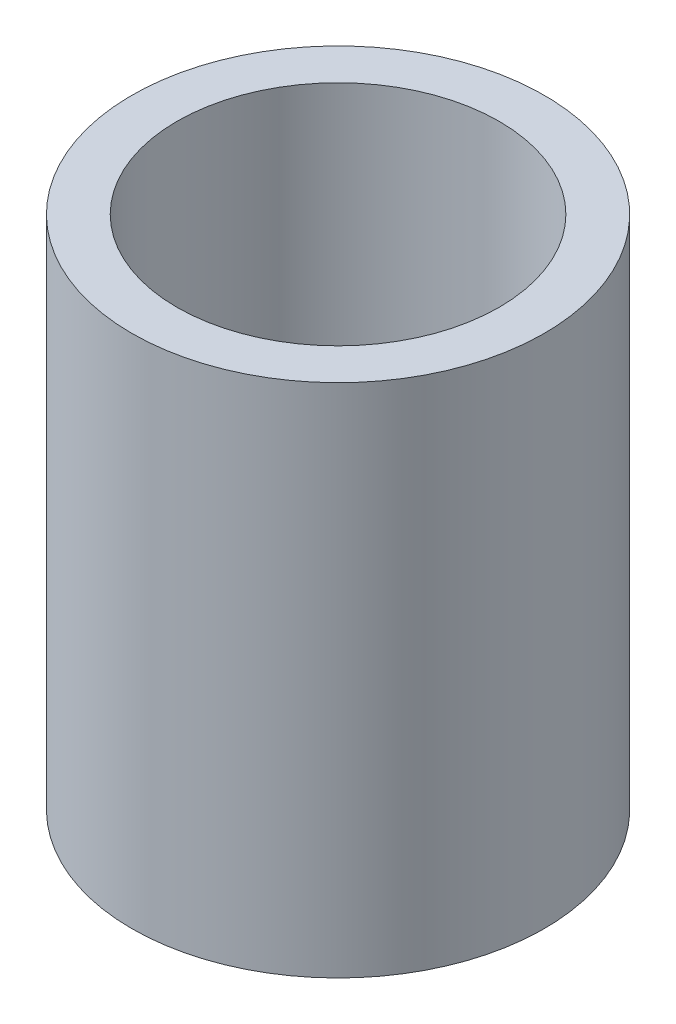
ISO-10303-21;
HEADER;
FILE_DESCRIPTION(('STEP AP214'),'2;1');
FILE_NAME('part.step','',(''),(''),'','','');
FILE_SCHEMA(('AUTOMOTIVE_DESIGN { 1 0 10303 214 1 1 1 1 }'));
ENDSEC;
DATA;
#1=APPLICATION_CONTEXT('core data for automotive mechanical design processes');
#2=APPLICATION_PROTOCOL_DEFINITION('international standard','automotive_design',2000,#1);
#3=PRODUCT_CONTEXT('',#1,'mechanical');
#4=PRODUCT('Part','Part','',(#3));
#5=PRODUCT_RELATED_PRODUCT_CATEGORY('part','',(#4));
#6=PRODUCT_DEFINITION_FORMATION('','',#4);
#7=PRODUCT_DEFINITION_CONTEXT('part definition',#1,'design');
#8=PRODUCT_DEFINITION('design','',#6,#7);
#9=PRODUCT_DEFINITION_SHAPE('','',#8);
#10=(LENGTH_UNIT() NAMED_UNIT(*) SI_UNIT(.MILLI.,.METRE.));
#11=(NAMED_UNIT(*) PLANE_ANGLE_UNIT() SI_UNIT($,.RADIAN.));
#12=(NAMED_UNIT(*) SI_UNIT($,.STERADIAN.) SOLID_ANGLE_UNIT());
#13=UNCERTAINTY_MEASURE_WITH_UNIT(LENGTH_MEASURE(1.E-05),#10,'distance_accuracy_value','');
#14=(GEOMETRIC_REPRESENTATION_CONTEXT(3) GLOBAL_UNCERTAINTY_ASSIGNED_CONTEXT((#13)) GLOBAL_UNIT_ASSIGNED_CONTEXT((#10,
#11,#12)) REPRESENTATION_CONTEXT('',''));
#15=CARTESIAN_POINT('',(0.,0.,0.));
#16=DIRECTION('',(0.,0.,1.));
#17=DIRECTION('',(1.,0.,0.));
#18=AXIS2_PLACEMENT_3D('',#15,#16,#17);
#19=CARTESIAN_POINT('',(0.,1.5,0.));
#20=DIRECTION('',(0.,-1.,0.));
#21=DIRECTION('',(0.,0.,-1.));
#22=AXIS2_PLACEMENT_3D('',#19,#20,#21);
#23=PLANE('',#22);
#24=CARTESIAN_POINT('',(0.,1.5,0.));
#25=DIRECTION('',(0.,1.,0.));
#26=DIRECTION('',(0.,0.,1.));
#27=AXIS2_PLACEMENT_3D('',#24,#25,#26);
#28=CIRCLE('',#27,3.125);
#29=CARTESIAN_POINT('',(0.,1.5,3.125));
#30=VERTEX_POINT('',#29);
#31=EDGE_CURVE('E55',#30,#30,#28,.T.);
#32=ORIENTED_EDGE('',*,*,#31,.F.);
#33=EDGE_LOOP('',(#32));
#34=FACE_BOUND('',#33,.T.);
#35=CARTESIAN_POINT('',(0.,1.5,0.));
#36=DIRECTION('',(0.,1.,0.));
#37=DIRECTION('',(0.,0.,1.));
#38=AXIS2_PLACEMENT_3D('',#35,#36,#37);
#39=CIRCLE('',#38,4.);
#40=CARTESIAN_POINT('',(0.,1.5,4.));
#41=VERTEX_POINT('',#40);
#42=EDGE_CURVE('E10',#41,#41,#39,.T.);
#43=ORIENTED_EDGE('',*,*,#42,.T.);
#44=EDGE_LOOP('',(#43));
#45=FACE_BOUND('',#44,.T.);
#46=ADVANCED_FACE('F41',(#34,#45),#23,.F.);
#47=CARTESIAN_POINT('',(0.,1.5,0.));
#48=DIRECTION('',(0.,1.,0.));
#49=DIRECTION('',(0.,0.,1.));
#50=AXIS2_PLACEMENT_3D('',#47,#48,#49);
#51=CYLINDRICAL_SURFACE('',#50,4.);
#52=CARTESIAN_POINT('',(0.,-8.5,0.));
#53=DIRECTION('',(0.,1.,0.));
#54=DIRECTION('',(0.,0.,1.));
#55=AXIS2_PLACEMENT_3D('',#52,#53,#54);
#56=CIRCLE('',#55,4.);
#57=CARTESIAN_POINT('',(0.,-8.5,4.));
#58=VERTEX_POINT('',#57);
#59=EDGE_CURVE('E47',#58,#58,#56,.T.);
#60=ORIENTED_EDGE('',*,*,#59,.T.);
#61=EDGE_LOOP('',(#60));
#62=FACE_BOUND('',#61,.T.);
#63=ORIENTED_EDGE('',*,*,#42,.F.);
#64=EDGE_LOOP('',(#63));
#65=FACE_BOUND('',#64,.T.);
#66=ADVANCED_FACE('F64',(#62,#65),#51,.T.);
#67=CARTESIAN_POINT('',(0.,-8.5,0.));
#68=DIRECTION('',(0.,-1.,0.));
#69=DIRECTION('',(0.,0.,-1.));
#70=AXIS2_PLACEMENT_3D('',#67,#68,#69);
#71=PLANE('',#70);
#72=CARTESIAN_POINT('',(0.,-8.5,0.));
#73=DIRECTION('',(0.,1.,0.));
#74=DIRECTION('',(0.,0.,1.));
#75=AXIS2_PLACEMENT_3D('',#72,#73,#74);
#76=CIRCLE('',#75,3.125);
#77=CARTESIAN_POINT('',(0.,-8.5,3.125));
#78=VERTEX_POINT('',#77);
#79=EDGE_CURVE('E51',#78,#78,#76,.T.);
#80=ORIENTED_EDGE('',*,*,#79,.T.);
#81=EDGE_LOOP('',(#80));
#82=FACE_BOUND('',#81,.T.);
#83=ORIENTED_EDGE('',*,*,#59,.F.);
#84=EDGE_LOOP('',(#83));
#85=FACE_BOUND('',#84,.T.);
#86=ADVANCED_FACE('F68',(#82,#85),#71,.T.);
#87=CARTESIAN_POINT('',(0.,1.5,0.));
#88=DIRECTION('',(0.,1.,0.));
#89=DIRECTION('',(0.,0.,1.));
#90=AXIS2_PLACEMENT_3D('',#87,#88,#89);
#91=CYLINDRICAL_SURFACE('',#90,3.125);
#92=ORIENTED_EDGE('',*,*,#79,.F.);
#93=EDGE_LOOP('',(#92));
#94=FACE_BOUND('',#93,.T.);
#95=ORIENTED_EDGE('',*,*,#31,.T.);
#96=EDGE_LOOP('',(#95));
#97=FACE_BOUND('',#96,.T.);
#98=ADVANCED_FACE('F61',(#94,#97),#91,.F.);
#99=CLOSED_SHELL('',(#46,#66,#86,#98));
#100=MANIFOLD_SOLID_BREP('B2',#99);
#101=ADVANCED_BREP_SHAPE_REPRESENTATION('',(#18,#100),#14);
#102=SHAPE_DEFINITION_REPRESENTATION(#9,#101);
ENDSEC;
END-ISO-10303-21;
